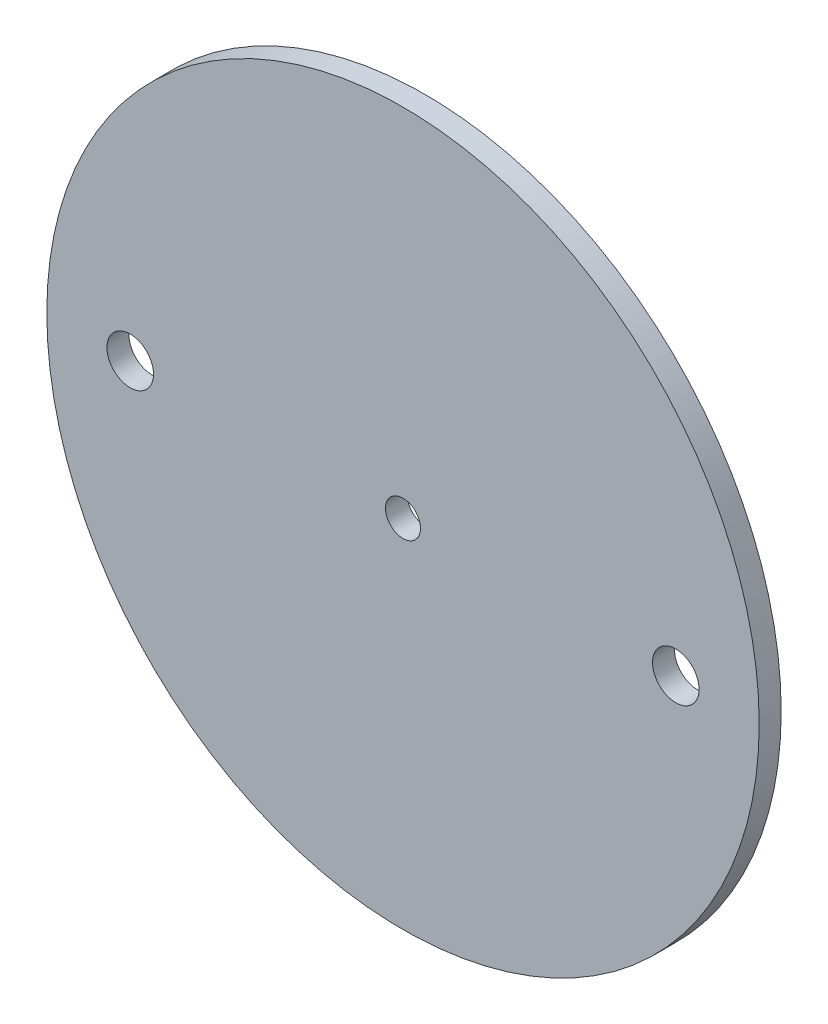
ISO-10303-21;
HEADER;
FILE_DESCRIPTION(('STEP AP214'),'2;1');
FILE_NAME('part.step','',(''),(''),'','','');
FILE_SCHEMA(('AUTOMOTIVE_DESIGN { 1 0 10303 214 1 1 1 1 }'));
ENDSEC;
DATA;
#1=APPLICATION_CONTEXT('core data for automotive mechanical design processes');
#2=APPLICATION_PROTOCOL_DEFINITION('international standard','automotive_design',2000,#1);
#3=PRODUCT_CONTEXT('',#1,'mechanical');
#4=PRODUCT('Part','Part','',(#3));
#5=PRODUCT_RELATED_PRODUCT_CATEGORY('part','',(#4));
#6=PRODUCT_DEFINITION_FORMATION('','',#4);
#7=PRODUCT_DEFINITION_CONTEXT('part definition',#1,'design');
#8=PRODUCT_DEFINITION('design','',#6,#7);
#9=PRODUCT_DEFINITION_SHAPE('','',#8);
#10=(LENGTH_UNIT() NAMED_UNIT(*) SI_UNIT(.MILLI.,.METRE.));
#11=(NAMED_UNIT(*) PLANE_ANGLE_UNIT() SI_UNIT($,.RADIAN.));
#12=(NAMED_UNIT(*) SI_UNIT($,.STERADIAN.) SOLID_ANGLE_UNIT());
#13=UNCERTAINTY_MEASURE_WITH_UNIT(LENGTH_MEASURE(1.E-05),#10,'distance_accuracy_value','');
#14=(GEOMETRIC_REPRESENTATION_CONTEXT(3) GLOBAL_UNCERTAINTY_ASSIGNED_CONTEXT((#13)) GLOBAL_UNIT_ASSIGNED_CONTEXT((#10,
#11,#12)) REPRESENTATION_CONTEXT('',''));
#15=CARTESIAN_POINT('',(0.,0.,0.));
#16=DIRECTION('',(0.,0.,1.));
#17=DIRECTION('',(1.,0.,0.));
#18=AXIS2_PLACEMENT_3D('',#15,#16,#17);
#19=CARTESIAN_POINT('',(0.,0.,2.9972));
#20=DIRECTION('',(0.,0.,-1.));
#21=DIRECTION('',(-1.,0.,0.));
#22=AXIS2_PLACEMENT_3D('',#19,#20,#21);
#23=CYLINDRICAL_SURFACE('',#22,48.5394);
#24=CARTESIAN_POINT('',(0.,0.,2.9972));
#25=DIRECTION('',(0.,0.,1.));
#26=DIRECTION('',(1.,0.,0.));
#27=AXIS2_PLACEMENT_3D('',#24,#25,#26);
#28=CIRCLE('',#27,48.5394);
#29=CARTESIAN_POINT('',(-48.5394,0.,2.9972));
#30=VERTEX_POINT('',#29);
#31=EDGE_CURVE('E10',#30,#30,#28,.T.);
#32=CARTESIAN_POINT('',(0.,0.,0.));
#33=DIRECTION('',(0.,0.,1.));
#34=DIRECTION('',(1.,0.,0.));
#35=AXIS2_PLACEMENT_3D('',#32,#33,#34);
#36=CIRCLE('',#35,48.5394);
#37=CARTESIAN_POINT('',(-48.5394,0.,0.));
#38=VERTEX_POINT('',#37);
#39=EDGE_CURVE('E34',#38,#38,#36,.T.);
#40=CARTESIAN_POINT('',(-48.5394,0.,2.9972));
#41=CARTESIAN_POINT('',(-48.5394,0.,2.96597916666667));
#42=CARTESIAN_POINT('',(-48.5394,0.,2.93475833333333));
#43=CARTESIAN_POINT('',(-48.5394,0.,2.87231666666667));
#44=CARTESIAN_POINT('',(-48.5394,0.,2.84109583333333));
#45=CARTESIAN_POINT('',(-48.5394,0.,2.77865416666667));
#46=CARTESIAN_POINT('',(-48.5394,0.,2.74743333333333));
#47=CARTESIAN_POINT('',(-48.5394,0.,2.68499166666667));
#48=CARTESIAN_POINT('',(-48.5394,0.,2.65377083333333));
#49=CARTESIAN_POINT('',(-48.5394,0.,2.59132916666667));
#50=CARTESIAN_POINT('',(-48.5394,0.,2.56010833333333));
#51=CARTESIAN_POINT('',(-48.5394,0.,2.49766666666667));
#52=CARTESIAN_POINT('',(-48.5394,0.,2.46644583333333));
#53=CARTESIAN_POINT('',(-48.5394,0.,2.40400416666667));
#54=CARTESIAN_POINT('',(-48.5394,0.,2.37278333333333));
#55=CARTESIAN_POINT('',(-48.5394,0.,2.31034166666667));
#56=CARTESIAN_POINT('',(-48.5394,0.,2.27912083333333));
#57=CARTESIAN_POINT('',(-48.5394,0.,2.21667916666667));
#58=CARTESIAN_POINT('',(-48.5394,0.,2.18545833333333));
#59=CARTESIAN_POINT('',(-48.5394,0.,2.12301666666667));
#60=CARTESIAN_POINT('',(-48.5394,0.,2.09179583333333));
#61=CARTESIAN_POINT('',(-48.5394,0.,2.02935416666667));
#62=CARTESIAN_POINT('',(-48.5394,0.,1.99813333333333));
#63=CARTESIAN_POINT('',(-48.5394,0.,1.93569166666667));
#64=CARTESIAN_POINT('',(-48.5394,0.,1.90447083333333));
#65=CARTESIAN_POINT('',(-48.5394,0.,1.84202916666667));
#66=CARTESIAN_POINT('',(-48.5394,0.,1.81080833333333));
#67=CARTESIAN_POINT('',(-48.5394,0.,1.74836666666667));
#68=CARTESIAN_POINT('',(-48.5394,0.,1.71714583333333));
#69=CARTESIAN_POINT('',(-48.5394,0.,1.65470416666667));
#70=CARTESIAN_POINT('',(-48.5394,0.,1.62348333333333));
#71=CARTESIAN_POINT('',(-48.5394,0.,1.56104166666667));
#72=CARTESIAN_POINT('',(-48.5394,0.,1.52982083333333));
#73=CARTESIAN_POINT('',(-48.5394,0.,1.46737916666667));
#74=CARTESIAN_POINT('',(-48.5394,0.,1.43615833333333));
#75=CARTESIAN_POINT('',(-48.5394,0.,1.37371666666667));
#76=CARTESIAN_POINT('',(-48.5394,0.,1.34249583333333));
#77=CARTESIAN_POINT('',(-48.5394,0.,1.28005416666667));
#78=CARTESIAN_POINT('',(-48.5394,0.,1.24883333333333));
#79=CARTESIAN_POINT('',(-48.5394,0.,1.18639166666667));
#80=CARTESIAN_POINT('',(-48.5394,0.,1.15517083333333));
#81=CARTESIAN_POINT('',(-48.5394,0.,1.09272916666667));
#82=CARTESIAN_POINT('',(-48.5394,0.,1.06150833333333));
#83=CARTESIAN_POINT('',(-48.5394,0.,0.999066666666667));
#84=CARTESIAN_POINT('',(-48.5394,0.,0.967845833333333));
#85=CARTESIAN_POINT('',(-48.5394,0.,0.905404166666667));
#86=CARTESIAN_POINT('',(-48.5394,0.,0.874183333333333));
#87=CARTESIAN_POINT('',(-48.5394,0.,0.811741666666667));
#88=CARTESIAN_POINT('',(-48.5394,0.,0.780520833333333));
#89=CARTESIAN_POINT('',(-48.5394,0.,0.718079166666667));
#90=CARTESIAN_POINT('',(-48.5394,0.,0.686858333333333));
#91=CARTESIAN_POINT('',(-48.5394,0.,0.624416666666667));
#92=CARTESIAN_POINT('',(-48.5394,0.,0.593195833333333));
#93=CARTESIAN_POINT('',(-48.5394,0.,0.530754166666667));
#94=CARTESIAN_POINT('',(-48.5394,0.,0.499533333333333));
#95=CARTESIAN_POINT('',(-48.5394,0.,0.437091666666667));
#96=CARTESIAN_POINT('',(-48.5394,0.,0.405870833333333));
#97=CARTESIAN_POINT('',(-48.5394,0.,0.343429166666667));
#98=CARTESIAN_POINT('',(-48.5394,0.,0.312208333333333));
#99=CARTESIAN_POINT('',(-48.5394,0.,0.249766666666667));
#100=CARTESIAN_POINT('',(-48.5394,0.,0.218545833333333));
#101=CARTESIAN_POINT('',(-48.5394,0.,0.156104166666667));
#102=CARTESIAN_POINT('',(-48.5394,0.,0.124883333333333));
#103=CARTESIAN_POINT('',(-48.5394,0.,0.0624416666666668));
#104=CARTESIAN_POINT('',(-48.5394,0.,0.0312208333333333));
#105=CARTESIAN_POINT('',(-48.5394,0.,0.));
#106=B_SPLINE_CURVE_WITH_KNOTS('',3,(#40,#41,#42,#43,#44,#45,#46,#47,#48,#49,#50,#51,#52,#53,
#54,#55,#56,#57,#58,#59,#60,#61,#62,#63,#64,#65,#66,#67,#68,#69,#70,#71,#72,#73,#74,#75,#76,#77,
#78,#79,#80,#81,#82,#83,#84,#85,#86,#87,#88,#89,#90,#91,#92,#93,#94,#95,#96,#97,#98,#99,#100,
#101,#102,#103,#104,#105),.UNSPECIFIED.,.F.,.F.,(4,2,2,2,2,2,2,2,2,2,2,2,2,2,2,2,2,2,2,2,2,2,2,
2,2,2,2,2,2,2,2,2,4),(0.,0.0936624999999997,0.187325,0.2809875,0.37465,0.4683125,0.561975,
0.655637499999999,0.7493,0.8429625,0.936624999999999,1.0302875,1.12395,1.2176125,1.311275,
1.4049375,1.4986,1.5922625,1.685925,1.7795875,1.87325,1.9669125,2.060575,2.1542375,2.2479,
2.3415625,2.435225,2.5288875,2.62255,2.7162125,2.809875,2.9035375,2.9972),.UNSPECIFIED.);
#107=EDGE_CURVE('BSEAM31',#30,#38,#106,.T.);
#108=ORIENTED_EDGE('',*,*,#31,.F.);
#109=ORIENTED_EDGE('',*,*,#39,.T.);
#110=ORIENTED_EDGE('',*,*,#107,.T.);
#111=ORIENTED_EDGE('',*,*,#107,.F.);
#112=EDGE_LOOP('',(#108,#110,#109,#111));
#113=FACE_BOUND('',#112,.T.);
#114=ADVANCED_FACE('F31',(#113),#23,.T.);
#115=CARTESIAN_POINT('',(0.,0.,2.9972));
#116=DIRECTION('',(0.,0.,1.));
#117=DIRECTION('',(1.,0.,0.));
#118=AXIS2_PLACEMENT_3D('',#115,#116,#117);
#119=PLANE('',#118);
#120=CARTESIAN_POINT('',(-37.1729,0.,2.9972));
#121=DIRECTION('',(0.,0.,1.));
#122=DIRECTION('',(1.,0.,0.));
#123=AXIS2_PLACEMENT_3D('',#120,#121,#122);
#124=CIRCLE('',#123,3.17500000000001);
#125=CARTESIAN_POINT('',(-33.9979,0.,2.9972));
#126=VERTEX_POINT('',#125);
#127=EDGE_CURVE('E55',#126,#126,#124,.T.);
#128=ORIENTED_EDGE('',*,*,#127,.F.);
#129=EDGE_LOOP('',(#128));
#130=FACE_BOUND('',#129,.T.);
#131=CARTESIAN_POINT('',(37.1729,0.,2.9972));
#132=DIRECTION('',(0.,0.,1.));
#133=DIRECTION('',(1.,0.,0.));
#134=AXIS2_PLACEMENT_3D('',#131,#132,#133);
#135=CIRCLE('',#134,3.17500000000001);
#136=CARTESIAN_POINT('',(40.3479,0.,2.9972));
#137=VERTEX_POINT('',#136);
#138=EDGE_CURVE('E49',#137,#137,#135,.T.);
#139=ORIENTED_EDGE('',*,*,#138,.F.);
#140=EDGE_LOOP('',(#139));
#141=FACE_BOUND('',#140,.T.);
#142=CARTESIAN_POINT('',(0.,0.,2.9972));
#143=DIRECTION('',(0.,0.,1.));
#144=DIRECTION('',(1.,0.,0.));
#145=AXIS2_PLACEMENT_3D('',#142,#143,#144);
#146=CIRCLE('',#145,2.38125);
#147=CARTESIAN_POINT('',(2.38125,0.,2.9972));
#148=VERTEX_POINT('',#147);
#149=EDGE_CURVE('E43',#148,#148,#146,.T.);
#150=ORIENTED_EDGE('',*,*,#149,.F.);
#151=EDGE_LOOP('',(#150));
#152=FACE_BOUND('',#151,.T.);
#153=ORIENTED_EDGE('',*,*,#31,.T.);
#154=EDGE_LOOP('',(#153));
#155=FACE_BOUND('',#154,.T.);
#156=ADVANCED_FACE('F71',(#130,#141,#152,#155),#119,.T.);
#157=CARTESIAN_POINT('',(0.,0.,0.));
#158=DIRECTION('',(0.,0.,1.));
#159=DIRECTION('',(1.,0.,0.));
#160=AXIS2_PLACEMENT_3D('',#157,#158,#159);
#161=PLANE('',#160);
#162=CARTESIAN_POINT('',(-37.1729,0.,0.));
#163=DIRECTION('',(0.,0.,1.));
#164=DIRECTION('',(1.,0.,0.));
#165=AXIS2_PLACEMENT_3D('',#162,#163,#164);
#166=CIRCLE('',#165,3.17500000000001);
#167=CARTESIAN_POINT('',(-33.9979,0.,0.));
#168=VERTEX_POINT('',#167);
#169=EDGE_CURVE('E52',#168,#168,#166,.T.);
#170=ORIENTED_EDGE('',*,*,#169,.T.);
#171=EDGE_LOOP('',(#170));
#172=FACE_BOUND('',#171,.T.);
#173=CARTESIAN_POINT('',(37.1729,0.,0.));
#174=DIRECTION('',(0.,0.,1.));
#175=DIRECTION('',(1.,0.,0.));
#176=AXIS2_PLACEMENT_3D('',#173,#174,#175);
#177=CIRCLE('',#176,3.17500000000001);
#178=CARTESIAN_POINT('',(40.3479,0.,0.));
#179=VERTEX_POINT('',#178);
#180=EDGE_CURVE('E46',#179,#179,#177,.T.);
#181=ORIENTED_EDGE('',*,*,#180,.T.);
#182=EDGE_LOOP('',(#181));
#183=FACE_BOUND('',#182,.T.);
#184=CARTESIAN_POINT('',(0.,0.,0.));
#185=DIRECTION('',(0.,0.,1.));
#186=DIRECTION('',(1.,0.,0.));
#187=AXIS2_PLACEMENT_3D('',#184,#185,#186);
#188=CIRCLE('',#187,2.38125);
#189=CARTESIAN_POINT('',(2.38125,0.,0.));
#190=VERTEX_POINT('',#189);
#191=EDGE_CURVE('E41',#190,#190,#188,.T.);
#192=ORIENTED_EDGE('',*,*,#191,.T.);
#193=EDGE_LOOP('',(#192));
#194=FACE_BOUND('',#193,.T.);
#195=ORIENTED_EDGE('',*,*,#39,.F.);
#196=EDGE_LOOP('',(#195));
#197=FACE_BOUND('',#196,.T.);
#198=ADVANCED_FACE('F61',(#172,#183,#194,#197),#161,.F.);
#199=CARTESIAN_POINT('',(0.,0.,0.));
#200=DIRECTION('',(0.,0.,1.));
#201=DIRECTION('',(1.,0.,0.));
#202=AXIS2_PLACEMENT_3D('',#199,#200,#201);
#203=CYLINDRICAL_SURFACE('',#202,2.38125);
#204=CARTESIAN_POINT('',(2.38125,0.,0.));
#205=CARTESIAN_POINT('',(2.38125,0.,0.0312208333333333));
#206=CARTESIAN_POINT('',(2.38125,0.,0.0624416666666667));
#207=CARTESIAN_POINT('',(2.38125,0.,0.124883333333333));
#208=CARTESIAN_POINT('',(2.38125,0.,0.156104166666667));
#209=CARTESIAN_POINT('',(2.38125,0.,0.218545833333333));
#210=CARTESIAN_POINT('',(2.38125,0.,0.249766666666667));
#211=CARTESIAN_POINT('',(2.38125,0.,0.312208333333333));
#212=CARTESIAN_POINT('',(2.38125,0.,0.343429166666667));
#213=CARTESIAN_POINT('',(2.38125,0.,0.405870833333333));
#214=CARTESIAN_POINT('',(2.38125,0.,0.437091666666667));
#215=CARTESIAN_POINT('',(2.38125,0.,0.499533333333333));
#216=CARTESIAN_POINT('',(2.38125,0.,0.530754166666667));
#217=CARTESIAN_POINT('',(2.38125,0.,0.593195833333333));
#218=CARTESIAN_POINT('',(2.38125,0.,0.624416666666667));
#219=CARTESIAN_POINT('',(2.38125,0.,0.686858333333333));
#220=CARTESIAN_POINT('',(2.38125,0.,0.718079166666667));
#221=CARTESIAN_POINT('',(2.38125,0.,0.780520833333333));
#222=CARTESIAN_POINT('',(2.38125,0.,0.811741666666667));
#223=CARTESIAN_POINT('',(2.38125,0.,0.874183333333333));
#224=CARTESIAN_POINT('',(2.38125,0.,0.905404166666667));
#225=CARTESIAN_POINT('',(2.38125,0.,0.967845833333333));
#226=CARTESIAN_POINT('',(2.38125,0.,0.999066666666667));
#227=CARTESIAN_POINT('',(2.38125,0.,1.06150833333333));
#228=CARTESIAN_POINT('',(2.38125,0.,1.09272916666667));
#229=CARTESIAN_POINT('',(2.38125,0.,1.15517083333333));
#230=CARTESIAN_POINT('',(2.38125,0.,1.18639166666667));
#231=CARTESIAN_POINT('',(2.38125,0.,1.24883333333333));
#232=CARTESIAN_POINT('',(2.38125,0.,1.28005416666667));
#233=CARTESIAN_POINT('',(2.38125,0.,1.34249583333333));
#234=CARTESIAN_POINT('',(2.38125,0.,1.37371666666667));
#235=CARTESIAN_POINT('',(2.38125,0.,1.43615833333333));
#236=CARTESIAN_POINT('',(2.38125,0.,1.46737916666667));
#237=CARTESIAN_POINT('',(2.38125,0.,1.52982083333333));
#238=CARTESIAN_POINT('',(2.38125,0.,1.56104166666667));
#239=CARTESIAN_POINT('',(2.38125,0.,1.62348333333333));
#240=CARTESIAN_POINT('',(2.38125,0.,1.65470416666667));
#241=CARTESIAN_POINT('',(2.38125,0.,1.71714583333333));
#242=CARTESIAN_POINT('',(2.38125,0.,1.74836666666667));
#243=CARTESIAN_POINT('',(2.38125,0.,1.81080833333333));
#244=CARTESIAN_POINT('',(2.38125,0.,1.84202916666667));
#245=CARTESIAN_POINT('',(2.38125,0.,1.90447083333333));
#246=CARTESIAN_POINT('',(2.38125,0.,1.93569166666667));
#247=CARTESIAN_POINT('',(2.38125,0.,1.99813333333333));
#248=CARTESIAN_POINT('',(2.38125,0.,2.02935416666667));
#249=CARTESIAN_POINT('',(2.38125,0.,2.09179583333333));
#250=CARTESIAN_POINT('',(2.38125,0.,2.12301666666667));
#251=CARTESIAN_POINT('',(2.38125,0.,2.18545833333333));
#252=CARTESIAN_POINT('',(2.38125,0.,2.21667916666667));
#253=CARTESIAN_POINT('',(2.38125,0.,2.27912083333333));
#254=CARTESIAN_POINT('',(2.38125,0.,2.31034166666667));
#255=CARTESIAN_POINT('',(2.38125,0.,2.37278333333333));
#256=CARTESIAN_POINT('',(2.38125,0.,2.40400416666667));
#257=CARTESIAN_POINT('',(2.38125,0.,2.46644583333333));
#258=CARTESIAN_POINT('',(2.38125,0.,2.49766666666667));
#259=CARTESIAN_POINT('',(2.38125,0.,2.56010833333333));
#260=CARTESIAN_POINT('',(2.38125,0.,2.59132916666667));
#261=CARTESIAN_POINT('',(2.38125,0.,2.65377083333333));
#262=CARTESIAN_POINT('',(2.38125,0.,2.68499166666667));
#263=CARTESIAN_POINT('',(2.38125,0.,2.74743333333333));
#264=CARTESIAN_POINT('',(2.38125,0.,2.77865416666667));
#265=CARTESIAN_POINT('',(2.38125,0.,2.84109583333333));
#266=CARTESIAN_POINT('',(2.38125,0.,2.87231666666667));
#267=CARTESIAN_POINT('',(2.38125,0.,2.93475833333333));
#268=CARTESIAN_POINT('',(2.38125,0.,2.96597916666667));
#269=CARTESIAN_POINT('',(2.38125,0.,2.9972));
#270=B_SPLINE_CURVE_WITH_KNOTS('',3,(#204,#205,#206,#207,#208,#209,#210,#211,#212,#213,#214,
#215,#216,#217,#218,#219,#220,#221,#222,#223,#224,#225,#226,#227,#228,#229,#230,#231,#232,#233,
#234,#235,#236,#237,#238,#239,#240,#241,#242,#243,#244,#245,#246,#247,#248,#249,#250,#251,#252,
#253,#254,#255,#256,#257,#258,#259,#260,#261,#262,#263,#264,#265,#266,#267,#268,#269),
.UNSPECIFIED.,.F.,.F.,(4,2,2,2,2,2,2,2,2,2,2,2,2,2,2,2,2,2,2,2,2,2,2,2,2,2,2,2,2,2,2,2,4),(0.,
0.0936625,0.187325,0.2809875,0.37465,0.4683125,0.561975,0.6556375,0.7493,0.8429625,0.936625,
1.0302875,1.12395,1.2176125,1.311275,1.4049375,1.4986,1.5922625,1.685925,1.7795875,1.87325,
1.9669125,2.060575,2.1542375,2.2479,2.3415625,2.435225,2.5288875,2.62255,2.7162125,2.809875,
2.9035375,2.9972),.UNSPECIFIED.);
#271=EDGE_CURVE('BSEAM79',#190,#148,#270,.T.);
#272=ORIENTED_EDGE('',*,*,#191,.F.);
#273=ORIENTED_EDGE('',*,*,#149,.T.);
#274=ORIENTED_EDGE('',*,*,#271,.T.);
#275=ORIENTED_EDGE('',*,*,#271,.F.);
#276=EDGE_LOOP('',(#272,#274,#273,#275));
#277=FACE_BOUND('',#276,.T.);
#278=ADVANCED_FACE('F79',(#277),#203,.F.);
#279=CARTESIAN_POINT('',(37.1729,0.,0.));
#280=DIRECTION('',(0.,0.,1.));
#281=DIRECTION('',(1.,0.,0.));
#282=AXIS2_PLACEMENT_3D('',#279,#280,#281);
#283=CYLINDRICAL_SURFACE('',#282,3.17500000000001);
#284=CARTESIAN_POINT('',(40.3479,0.,0.));
#285=CARTESIAN_POINT('',(40.3479,0.,0.0312208333333333));
#286=CARTESIAN_POINT('',(40.3479,0.,0.0624416666666667));
#287=CARTESIAN_POINT('',(40.3479,0.,0.124883333333333));
#288=CARTESIAN_POINT('',(40.3479,0.,0.156104166666667));
#289=CARTESIAN_POINT('',(40.3479,0.,0.218545833333333));
#290=CARTESIAN_POINT('',(40.3479,0.,0.249766666666667));
#291=CARTESIAN_POINT('',(40.3479,0.,0.312208333333333));
#292=CARTESIAN_POINT('',(40.3479,0.,0.343429166666667));
#293=CARTESIAN_POINT('',(40.3479,0.,0.405870833333333));
#294=CARTESIAN_POINT('',(40.3479,0.,0.437091666666667));
#295=CARTESIAN_POINT('',(40.3479,0.,0.499533333333333));
#296=CARTESIAN_POINT('',(40.3479,0.,0.530754166666667));
#297=CARTESIAN_POINT('',(40.3479,0.,0.593195833333333));
#298=CARTESIAN_POINT('',(40.3479,0.,0.624416666666667));
#299=CARTESIAN_POINT('',(40.3479,0.,0.686858333333333));
#300=CARTESIAN_POINT('',(40.3479,0.,0.718079166666667));
#301=CARTESIAN_POINT('',(40.3479,0.,0.780520833333333));
#302=CARTESIAN_POINT('',(40.3479,0.,0.811741666666667));
#303=CARTESIAN_POINT('',(40.3479,0.,0.874183333333333));
#304=CARTESIAN_POINT('',(40.3479,0.,0.905404166666667));
#305=CARTESIAN_POINT('',(40.3479,0.,0.967845833333333));
#306=CARTESIAN_POINT('',(40.3479,0.,0.999066666666667));
#307=CARTESIAN_POINT('',(40.3479,0.,1.06150833333333));
#308=CARTESIAN_POINT('',(40.3479,0.,1.09272916666667));
#309=CARTESIAN_POINT('',(40.3479,0.,1.15517083333333));
#310=CARTESIAN_POINT('',(40.3479,0.,1.18639166666667));
#311=CARTESIAN_POINT('',(40.3479,0.,1.24883333333333));
#312=CARTESIAN_POINT('',(40.3479,0.,1.28005416666667));
#313=CARTESIAN_POINT('',(40.3479,0.,1.34249583333333));
#314=CARTESIAN_POINT('',(40.3479,0.,1.37371666666667));
#315=CARTESIAN_POINT('',(40.3479,0.,1.43615833333333));
#316=CARTESIAN_POINT('',(40.3479,0.,1.46737916666667));
#317=CARTESIAN_POINT('',(40.3479,0.,1.52982083333333));
#318=CARTESIAN_POINT('',(40.3479,0.,1.56104166666667));
#319=CARTESIAN_POINT('',(40.3479,0.,1.62348333333333));
#320=CARTESIAN_POINT('',(40.3479,0.,1.65470416666667));
#321=CARTESIAN_POINT('',(40.3479,0.,1.71714583333333));
#322=CARTESIAN_POINT('',(40.3479,0.,1.74836666666667));
#323=CARTESIAN_POINT('',(40.3479,0.,1.81080833333333));
#324=CARTESIAN_POINT('',(40.3479,0.,1.84202916666667));
#325=CARTESIAN_POINT('',(40.3479,0.,1.90447083333333));
#326=CARTESIAN_POINT('',(40.3479,0.,1.93569166666667));
#327=CARTESIAN_POINT('',(40.3479,0.,1.99813333333333));
#328=CARTESIAN_POINT('',(40.3479,0.,2.02935416666667));
#329=CARTESIAN_POINT('',(40.3479,0.,2.09179583333333));
#330=CARTESIAN_POINT('',(40.3479,0.,2.12301666666667));
#331=CARTESIAN_POINT('',(40.3479,0.,2.18545833333333));
#332=CARTESIAN_POINT('',(40.3479,0.,2.21667916666667));
#333=CARTESIAN_POINT('',(40.3479,0.,2.27912083333333));
#334=CARTESIAN_POINT('',(40.3479,0.,2.31034166666667));
#335=CARTESIAN_POINT('',(40.3479,0.,2.37278333333333));
#336=CARTESIAN_POINT('',(40.3479,0.,2.40400416666667));
#337=CARTESIAN_POINT('',(40.3479,0.,2.46644583333333));
#338=CARTESIAN_POINT('',(40.3479,0.,2.49766666666667));
#339=CARTESIAN_POINT('',(40.3479,0.,2.56010833333333));
#340=CARTESIAN_POINT('',(40.3479,0.,2.59132916666667));
#341=CARTESIAN_POINT('',(40.3479,0.,2.65377083333333));
#342=CARTESIAN_POINT('',(40.3479,0.,2.68499166666667));
#343=CARTESIAN_POINT('',(40.3479,0.,2.74743333333333));
#344=CARTESIAN_POINT('',(40.3479,0.,2.77865416666667));
#345=CARTESIAN_POINT('',(40.3479,0.,2.84109583333333));
#346=CARTESIAN_POINT('',(40.3479,0.,2.87231666666667));
#347=CARTESIAN_POINT('',(40.3479,0.,2.93475833333333));
#348=CARTESIAN_POINT('',(40.3479,0.,2.96597916666667));
#349=CARTESIAN_POINT('',(40.3479,0.,2.9972));
#350=B_SPLINE_CURVE_WITH_KNOTS('',3,(#284,#285,#286,#287,#288,#289,#290,#291,#292,#293,#294,
#295,#296,#297,#298,#299,#300,#301,#302,#303,#304,#305,#306,#307,#308,#309,#310,#311,#312,#313,
#314,#315,#316,#317,#318,#319,#320,#321,#322,#323,#324,#325,#326,#327,#328,#329,#330,#331,#332,
#333,#334,#335,#336,#337,#338,#339,#340,#341,#342,#343,#344,#345,#346,#347,#348,#349),
.UNSPECIFIED.,.F.,.F.,(4,2,2,2,2,2,2,2,2,2,2,2,2,2,2,2,2,2,2,2,2,2,2,2,2,2,2,2,2,2,2,2,4),(0.,
0.0936625,0.187325,0.2809875,0.37465,0.4683125,0.561975,0.6556375,0.7493,0.8429625,0.936625,
1.0302875,1.12395,1.2176125,1.311275,1.4049375,1.4986,1.5922625,1.685925,1.7795875,1.87325,
1.9669125,2.060575,2.1542375,2.2479,2.3415625,2.435225,2.5288875,2.62255,2.7162125,2.809875,
2.9035375,2.9972),.UNSPECIFIED.);
#351=EDGE_CURVE('BSEAM67',#179,#137,#350,.T.);
#352=ORIENTED_EDGE('',*,*,#180,.F.);
#353=ORIENTED_EDGE('',*,*,#138,.T.);
#354=ORIENTED_EDGE('',*,*,#351,.T.);
#355=ORIENTED_EDGE('',*,*,#351,.F.);
#356=EDGE_LOOP('',(#352,#354,#353,#355));
#357=FACE_BOUND('',#356,.T.);
#358=ADVANCED_FACE('F67',(#357),#283,.F.);
#359=CARTESIAN_POINT('',(-37.1729,0.,0.));
#360=DIRECTION('',(0.,0.,1.));
#361=DIRECTION('',(1.,0.,0.));
#362=AXIS2_PLACEMENT_3D('',#359,#360,#361);
#363=CYLINDRICAL_SURFACE('',#362,3.17500000000001);
#364=CARTESIAN_POINT('',(-33.9979,0.,0.));
#365=CARTESIAN_POINT('',(-33.9979,0.,0.0312208333333333));
#366=CARTESIAN_POINT('',(-33.9979,0.,0.0624416666666667));
#367=CARTESIAN_POINT('',(-33.9979,0.,0.124883333333333));
#368=CARTESIAN_POINT('',(-33.9979,0.,0.156104166666667));
#369=CARTESIAN_POINT('',(-33.9979,0.,0.218545833333333));
#370=CARTESIAN_POINT('',(-33.9979,0.,0.249766666666667));
#371=CARTESIAN_POINT('',(-33.9979,0.,0.312208333333333));
#372=CARTESIAN_POINT('',(-33.9979,0.,0.343429166666667));
#373=CARTESIAN_POINT('',(-33.9979,0.,0.405870833333333));
#374=CARTESIAN_POINT('',(-33.9979,0.,0.437091666666667));
#375=CARTESIAN_POINT('',(-33.9979,0.,0.499533333333333));
#376=CARTESIAN_POINT('',(-33.9979,0.,0.530754166666667));
#377=CARTESIAN_POINT('',(-33.9979,0.,0.593195833333333));
#378=CARTESIAN_POINT('',(-33.9979,0.,0.624416666666667));
#379=CARTESIAN_POINT('',(-33.9979,0.,0.686858333333333));
#380=CARTESIAN_POINT('',(-33.9979,0.,0.718079166666667));
#381=CARTESIAN_POINT('',(-33.9979,0.,0.780520833333333));
#382=CARTESIAN_POINT('',(-33.9979,0.,0.811741666666667));
#383=CARTESIAN_POINT('',(-33.9979,0.,0.874183333333333));
#384=CARTESIAN_POINT('',(-33.9979,0.,0.905404166666667));
#385=CARTESIAN_POINT('',(-33.9979,0.,0.967845833333333));
#386=CARTESIAN_POINT('',(-33.9979,0.,0.999066666666667));
#387=CARTESIAN_POINT('',(-33.9979,0.,1.06150833333333));
#388=CARTESIAN_POINT('',(-33.9979,0.,1.09272916666667));
#389=CARTESIAN_POINT('',(-33.9979,0.,1.15517083333333));
#390=CARTESIAN_POINT('',(-33.9979,0.,1.18639166666667));
#391=CARTESIAN_POINT('',(-33.9979,0.,1.24883333333333));
#392=CARTESIAN_POINT('',(-33.9979,0.,1.28005416666667));
#393=CARTESIAN_POINT('',(-33.9979,0.,1.34249583333333));
#394=CARTESIAN_POINT('',(-33.9979,0.,1.37371666666667));
#395=CARTESIAN_POINT('',(-33.9979,0.,1.43615833333333));
#396=CARTESIAN_POINT('',(-33.9979,0.,1.46737916666667));
#397=CARTESIAN_POINT('',(-33.9979,0.,1.52982083333333));
#398=CARTESIAN_POINT('',(-33.9979,0.,1.56104166666667));
#399=CARTESIAN_POINT('',(-33.9979,0.,1.62348333333333));
#400=CARTESIAN_POINT('',(-33.9979,0.,1.65470416666667));
#401=CARTESIAN_POINT('',(-33.9979,0.,1.71714583333333));
#402=CARTESIAN_POINT('',(-33.9979,0.,1.74836666666667));
#403=CARTESIAN_POINT('',(-33.9979,0.,1.81080833333333));
#404=CARTESIAN_POINT('',(-33.9979,0.,1.84202916666667));
#405=CARTESIAN_POINT('',(-33.9979,0.,1.90447083333333));
#406=CARTESIAN_POINT('',(-33.9979,0.,1.93569166666667));
#407=CARTESIAN_POINT('',(-33.9979,0.,1.99813333333333));
#408=CARTESIAN_POINT('',(-33.9979,0.,2.02935416666667));
#409=CARTESIAN_POINT('',(-33.9979,0.,2.09179583333333));
#410=CARTESIAN_POINT('',(-33.9979,0.,2.12301666666667));
#411=CARTESIAN_POINT('',(-33.9979,0.,2.18545833333333));
#412=CARTESIAN_POINT('',(-33.9979,0.,2.21667916666667));
#413=CARTESIAN_POINT('',(-33.9979,0.,2.27912083333333));
#414=CARTESIAN_POINT('',(-33.9979,0.,2.31034166666667));
#415=CARTESIAN_POINT('',(-33.9979,0.,2.37278333333333));
#416=CARTESIAN_POINT('',(-33.9979,0.,2.40400416666667));
#417=CARTESIAN_POINT('',(-33.9979,0.,2.46644583333333));
#418=CARTESIAN_POINT('',(-33.9979,0.,2.49766666666667));
#419=CARTESIAN_POINT('',(-33.9979,0.,2.56010833333333));
#420=CARTESIAN_POINT('',(-33.9979,0.,2.59132916666667));
#421=CARTESIAN_POINT('',(-33.9979,0.,2.65377083333333));
#422=CARTESIAN_POINT('',(-33.9979,0.,2.68499166666667));
#423=CARTESIAN_POINT('',(-33.9979,0.,2.74743333333333));
#424=CARTESIAN_POINT('',(-33.9979,0.,2.77865416666667));
#425=CARTESIAN_POINT('',(-33.9979,0.,2.84109583333333));
#426=CARTESIAN_POINT('',(-33.9979,0.,2.87231666666667));
#427=CARTESIAN_POINT('',(-33.9979,0.,2.93475833333333));
#428=CARTESIAN_POINT('',(-33.9979,0.,2.96597916666667));
#429=CARTESIAN_POINT('',(-33.9979,0.,2.9972));
#430=B_SPLINE_CURVE_WITH_KNOTS('',3,(#364,#365,#366,#367,#368,#369,#370,#371,#372,#373,#374,
#375,#376,#377,#378,#379,#380,#381,#382,#383,#384,#385,#386,#387,#388,#389,#390,#391,#392,#393,
#394,#395,#396,#397,#398,#399,#400,#401,#402,#403,#404,#405,#406,#407,#408,#409,#410,#411,#412,
#413,#414,#415,#416,#417,#418,#419,#420,#421,#422,#423,#424,#425,#426,#427,#428,#429),
.UNSPECIFIED.,.F.,.F.,(4,2,2,2,2,2,2,2,2,2,2,2,2,2,2,2,2,2,2,2,2,2,2,2,2,2,2,2,2,2,2,2,4),(0.,
0.0936625,0.187325,0.2809875,0.37465,0.4683125,0.561975,0.6556375,0.7493,0.8429625,0.936625,
1.0302875,1.12395,1.2176125,1.311275,1.4049375,1.4986,1.5922625,1.685925,1.7795875,1.87325,
1.9669125,2.060575,2.1542375,2.2479,2.3415625,2.435225,2.5288875,2.62255,2.7162125,2.809875,
2.9035375,2.9972),.UNSPECIFIED.);
#431=EDGE_CURVE('BSEAM64',#168,#126,#430,.T.);
#432=ORIENTED_EDGE('',*,*,#169,.F.);
#433=ORIENTED_EDGE('',*,*,#127,.T.);
#434=ORIENTED_EDGE('',*,*,#431,.T.);
#435=ORIENTED_EDGE('',*,*,#431,.F.);
#436=EDGE_LOOP('',(#432,#434,#433,#435));
#437=FACE_BOUND('',#436,.T.);
#438=ADVANCED_FACE('F64',(#437),#363,.F.);
#439=CLOSED_SHELL('',(#114,#156,#198,#278,#358,#438));
#440=MANIFOLD_SOLID_BREP('B2',#439);
#441=ADVANCED_BREP_SHAPE_REPRESENTATION('',(#18,#440),#14);
#442=SHAPE_DEFINITION_REPRESENTATION(#9,#441);
ENDSEC;
END-ISO-10303-21;
